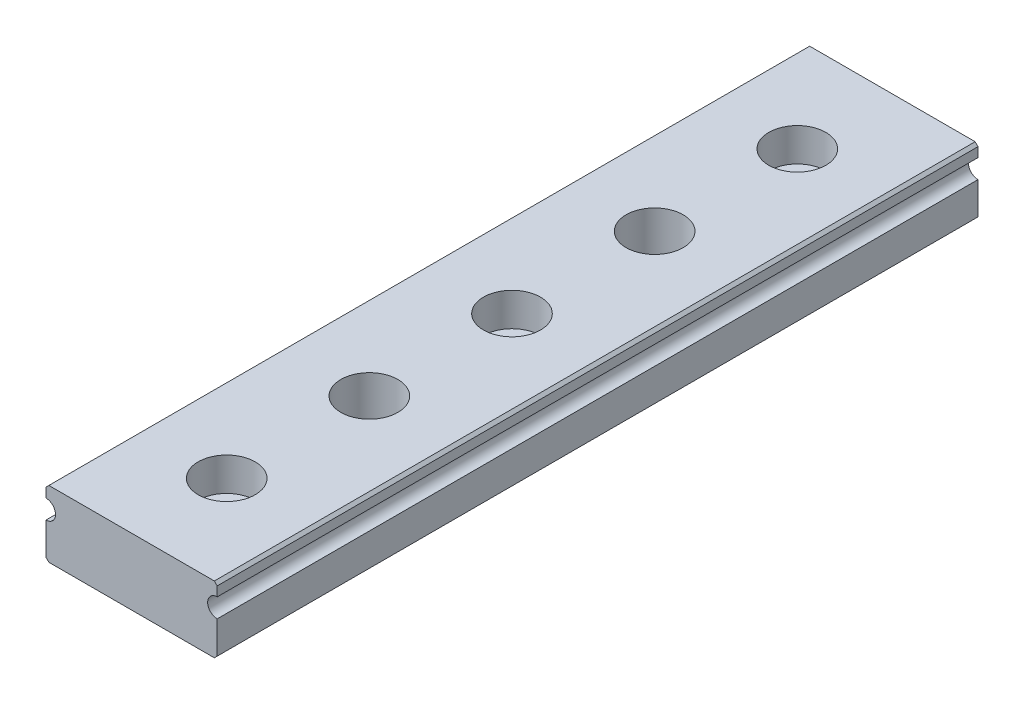
ISO-10303-21;
HEADER;
FILE_DESCRIPTION(('STEP AP214'),'2;1');
FILE_NAME('part.step','',(''),(''),'','','');
FILE_SCHEMA(('AUTOMOTIVE_DESIGN { 1 0 10303 214 1 1 1 1 }'));
ENDSEC;
DATA;
#1=APPLICATION_CONTEXT('core data for automotive mechanical design processes');
#2=APPLICATION_PROTOCOL_DEFINITION('international standard','automotive_design',2000,#1);
#3=PRODUCT_CONTEXT('',#1,'mechanical');
#4=PRODUCT('Part','Part','',(#3));
#5=PRODUCT_RELATED_PRODUCT_CATEGORY('part','',(#4));
#6=PRODUCT_DEFINITION_FORMATION('','',#4);
#7=PRODUCT_DEFINITION_CONTEXT('part definition',#1,'design');
#8=PRODUCT_DEFINITION('design','',#6,#7);
#9=PRODUCT_DEFINITION_SHAPE('','',#8);
#10=(LENGTH_UNIT() NAMED_UNIT(*) SI_UNIT(.MILLI.,.METRE.));
#11=(NAMED_UNIT(*) PLANE_ANGLE_UNIT() SI_UNIT($,.RADIAN.));
#12=(NAMED_UNIT(*) SI_UNIT($,.STERADIAN.) SOLID_ANGLE_UNIT());
#13=UNCERTAINTY_MEASURE_WITH_UNIT(LENGTH_MEASURE(1.E-05),#10,'distance_accuracy_value','');
#14=(GEOMETRIC_REPRESENTATION_CONTEXT(3) GLOBAL_UNCERTAINTY_ASSIGNED_CONTEXT((#13)) GLOBAL_UNIT_ASSIGNED_CONTEXT((#10,
#11,#12)) REPRESENTATION_CONTEXT('',''));
#15=CARTESIAN_POINT('',(0.,0.,0.));
#16=DIRECTION('',(0.,0.,1.));
#17=DIRECTION('',(1.,0.,0.));
#18=AXIS2_PLACEMENT_3D('',#15,#16,#17);
#19=CARTESIAN_POINT('',(0.,7.,0.));
#20=DIRECTION('',(0.,-1.,0.));
#21=DIRECTION('',(1.,0.,0.));
#22=AXIS2_PLACEMENT_3D('',#19,#20,#21);
#23=PLANE('',#22);
#24=CARTESIAN_POINT('',(-9.,7.,-70.));
#25=DIRECTION('',(0.,1.,0.));
#26=DIRECTION('',(0.,0.,1.));
#27=AXIS2_PLACEMENT_3D('',#24,#25,#26);
#28=CIRCLE('',#27,3.00000000000015);
#29=CARTESIAN_POINT('',(-9.,7.,-66.9999999999998));
#30=VERTEX_POINT('',#29);
#31=EDGE_CURVE('E311',#30,#30,#28,.T.);
#32=ORIENTED_EDGE('',*,*,#31,.F.);
#33=EDGE_LOOP('',(#32));
#34=FACE_BOUND('',#33,.T.);
#35=CARTESIAN_POINT('',(-9.,7.00000000000011,-55.));
#36=DIRECTION('',(0.,1.,0.));
#37=DIRECTION('',(0.,0.,1.));
#38=AXIS2_PLACEMENT_3D('',#35,#36,#37);
#39=CIRCLE('',#38,3.0000000000001);
#40=CARTESIAN_POINT('',(-9.,7.00000000000011,-51.9999999999999));
#41=VERTEX_POINT('',#40);
#42=EDGE_CURVE('E290',#41,#41,#39,.T.);
#43=ORIENTED_EDGE('',*,*,#42,.F.);
#44=EDGE_LOOP('',(#43));
#45=FACE_BOUND('',#44,.T.);
#46=CARTESIAN_POINT('',(-9.,7.,-10.));
#47=DIRECTION('',(0.,1.,0.));
#48=DIRECTION('',(0.,0.,1.));
#49=AXIS2_PLACEMENT_3D('',#46,#47,#48);
#50=CIRCLE('',#49,3.00000000000015);
#51=CARTESIAN_POINT('',(-9.,7.,-6.99999999999985));
#52=VERTEX_POINT('',#51);
#53=EDGE_CURVE('E287',#52,#52,#50,.T.);
#54=ORIENTED_EDGE('',*,*,#53,.F.);
#55=EDGE_LOOP('',(#54));
#56=FACE_BOUND('',#55,.T.);
#57=CARTESIAN_POINT('',(-9.,7.00000000000011,-25.));
#58=DIRECTION('',(0.,1.,0.));
#59=DIRECTION('',(0.,0.,1.));
#60=AXIS2_PLACEMENT_3D('',#57,#58,#59);
#61=CIRCLE('',#60,3.0000000000001);
#62=CARTESIAN_POINT('',(-9.,7.00000000000011,-21.9999999999999));
#63=VERTEX_POINT('',#62);
#64=EDGE_CURVE('E275',#63,#63,#61,.T.);
#65=ORIENTED_EDGE('',*,*,#64,.F.);
#66=EDGE_LOOP('',(#65));
#67=FACE_BOUND('',#66,.T.);
#68=DIRECTION('',(1.,0.,0.));
#69=VECTOR('',#68,1.);
#70=CARTESIAN_POINT('',(-18.0000000000009,7.,-80.));
#71=LINE('',#70,#69);
#72=CARTESIAN_POINT('',(-17.7000000000009,7.,-80.));
#73=VERTEX_POINT('',#72);
#74=CARTESIAN_POINT('',(-0.300000000000057,7.,-80.));
#75=VERTEX_POINT('',#74);
#76=EDGE_CURVE('E166',#73,#75,#71,.T.);
#77=ORIENTED_EDGE('',*,*,#76,.F.);
#78=DIRECTION('',(0.,0.,1.));
#79=VECTOR('',#78,1.);
#80=CARTESIAN_POINT('',(-17.7000000000009,7.,0.));
#81=LINE('',#80,#79);
#82=CARTESIAN_POINT('',(-17.7000000000009,7.,0.));
#83=VERTEX_POINT('',#82);
#84=EDGE_CURVE('E197',#73,#83,#81,.T.);
#85=ORIENTED_EDGE('',*,*,#84,.T.);
#86=DIRECTION('',(-1.,0.,0.));
#87=VECTOR('',#86,1.);
#88=CARTESIAN_POINT('',(0.,7.,0.));
#89=LINE('',#88,#87);
#90=CARTESIAN_POINT('',(-0.300000000000051,7.,0.));
#91=VERTEX_POINT('',#90);
#92=EDGE_CURVE('E168',#91,#83,#89,.T.);
#93=ORIENTED_EDGE('',*,*,#92,.F.);
#94=DIRECTION('',(0.,0.,-1.));
#95=VECTOR('',#94,1.);
#96=CARTESIAN_POINT('',(-0.300000000000051,7.,-80.));
#97=LINE('',#96,#95);
#98=EDGE_CURVE('E195',#91,#75,#97,.T.);
#99=ORIENTED_EDGE('',*,*,#98,.T.);
#100=EDGE_LOOP('',(#77,#85,#93,#99));
#101=FACE_BOUND('',#100,.T.);
#102=CARTESIAN_POINT('',(-9.,7.,-40.));
#103=DIRECTION('',(0.,1.,0.));
#104=DIRECTION('',(0.,0.,1.));
#105=AXIS2_PLACEMENT_3D('',#102,#103,#104);
#106=CIRCLE('',#105,3.00000000000015);
#107=CARTESIAN_POINT('',(-9.,7.,-36.9999999999999));
#108=VERTEX_POINT('',#107);
#109=EDGE_CURVE('E301',#108,#108,#106,.T.);
#110=ORIENTED_EDGE('',*,*,#109,.F.);
#111=EDGE_LOOP('',(#110));
#112=FACE_BOUND('',#111,.T.);
#113=ADVANCED_FACE('F35',(#34,#45,#56,#67,#101,#112),#23,.F.);
#114=CARTESIAN_POINT('',(0.,7.,-80.));
#115=DIRECTION('',(1.,0.,0.));
#116=DIRECTION('',(0.,1.,0.));
#117=AXIS2_PLACEMENT_3D('',#114,#115,#116);
#118=PLANE('',#117);
#119=DIRECTION('',(0.,-1.,0.));
#120=VECTOR('',#119,1.);
#121=CARTESIAN_POINT('',(0.,7.,0.));
#122=LINE('',#121,#120);
#123=CARTESIAN_POINT('',(0.,3.70000000000002,0.));
#124=VERTEX_POINT('',#123);
#125=CARTESIAN_POINT('',(0.,0.300000000000043,0.));
#126=VERTEX_POINT('',#125);
#127=EDGE_CURVE('E138',#124,#126,#122,.T.);
#128=ORIENTED_EDGE('',*,*,#127,.T.);
#129=DIRECTION('',(0.,0.,-1.));
#130=VECTOR('',#129,1.);
#131=CARTESIAN_POINT('',(0.,0.300000000000042,-80.));
#132=LINE('',#131,#130);
#133=CARTESIAN_POINT('',(0.,0.300000000000042,-80.));
#134=VERTEX_POINT('',#133);
#135=EDGE_CURVE('E43',#126,#134,#132,.T.);
#136=ORIENTED_EDGE('',*,*,#135,.T.);
#137=DIRECTION('',(0.,-1.,0.));
#138=VECTOR('',#137,1.);
#139=CARTESIAN_POINT('',(0.,7.,-80.));
#140=LINE('',#139,#138);
#141=CARTESIAN_POINT('',(0.,3.70000000000002,-80.));
#142=VERTEX_POINT('',#141);
#143=EDGE_CURVE('E139',#142,#134,#140,.T.);
#144=ORIENTED_EDGE('',*,*,#143,.F.);
#145=DIRECTION('',(0.,0.,-1.));
#146=VECTOR('',#145,1.);
#147=CARTESIAN_POINT('',(0.,3.70000000000002,-80.));
#148=LINE('',#147,#146);
#149=EDGE_CURVE('E147',#124,#142,#148,.T.);
#150=ORIENTED_EDGE('',*,*,#149,.F.);
#151=EDGE_LOOP('',(#128,#136,#144,#150));
#152=FACE_BOUND('',#151,.T.);
#153=ADVANCED_FACE('F214',(#152),#118,.T.);
#154=CARTESIAN_POINT('',(0.,7.,0.));
#155=DIRECTION('',(0.,0.,1.));
#156=DIRECTION('',(0.,-1.,0.));
#157=AXIS2_PLACEMENT_3D('',#154,#155,#156);
#158=PLANE('',#157);
#159=ORIENTED_EDGE('',*,*,#92,.T.);
#160=DIRECTION('',(-0.707106781186564,-0.707106781186531,0.));
#161=VECTOR('',#160,1.);
#162=CARTESIAN_POINT('',(-8.85000000000004,15.8500000000004,0.));
#163=LINE('',#162,#161);
#164=CARTESIAN_POINT('',(-18.0000000000009,6.69999999999998,0.));
#165=VERTEX_POINT('',#164);
#166=EDGE_CURVE('E203',#83,#165,#163,.T.);
#167=ORIENTED_EDGE('',*,*,#166,.T.);
#168=DIRECTION('',(0.,-1.,0.));
#169=VECTOR('',#168,1.);
#170=CARTESIAN_POINT('',(-18.0000000000009,7.,0.));
#171=LINE('',#170,#169);
#172=CARTESIAN_POINT('',(-18.0000000000009,5.69999999999998,1.11010799245048E-13));
#173=VERTEX_POINT('',#172);
#174=EDGE_CURVE('E176',#165,#173,#171,.T.);
#175=ORIENTED_EDGE('',*,*,#174,.T.);
#176=CARTESIAN_POINT('',(-18.0000000000014,4.7,1.11022302462516E-13));
#177=DIRECTION('',(0.,0.,-1.));
#178=DIRECTION('',(0.,1.,0.));
#179=AXIS2_PLACEMENT_3D('',#176,#177,#178);
#180=CIRCLE('',#179,0.99999999999998);
#181=CARTESIAN_POINT('',(-18.0000000000009,3.70000000000002,1.11033805679984E-13));
#182=VERTEX_POINT('',#181);
#183=EDGE_CURVE('E162',#173,#182,#180,.T.);
#184=ORIENTED_EDGE('',*,*,#183,.T.);
#185=CARTESIAN_POINT('',(-18.0000000000009,0.300000000000026,0.));
#186=VERTEX_POINT('',#185);
#187=EDGE_CURVE('E179',#182,#186,#171,.T.);
#188=ORIENTED_EDGE('',*,*,#187,.T.);
#189=DIRECTION('',(-0.707106781186531,0.707106781186564,0.));
#190=VECTOR('',#189,1.);
#191=CARTESIAN_POINT('',(-12.3500000000009,-5.3500000000003,0.));
#192=LINE('',#191,#190);
#193=CARTESIAN_POINT('',(-17.7000000000009,0.,0.));
#194=VERTEX_POINT('',#193);
#195=EDGE_CURVE('E56',#186,#194,#192,.F.);
#196=ORIENTED_EDGE('',*,*,#195,.T.);
#197=DIRECTION('',(-1.,0.,0.));
#198=VECTOR('',#197,1.);
#199=CARTESIAN_POINT('',(0.,0.,0.));
#200=LINE('',#199,#198);
#201=CARTESIAN_POINT('',(-0.300000000000023,0.,0.));
#202=VERTEX_POINT('',#201);
#203=EDGE_CURVE('E169',#202,#194,#200,.T.);
#204=ORIENTED_EDGE('',*,*,#203,.F.);
#205=DIRECTION('',(-0.707106781186523,-0.707106781186572,0.));
#206=VECTOR('',#205,1.);
#207=CARTESIAN_POINT('',(3.34999999999998,3.65000000000025,0.));
#208=LINE('',#207,#206);
#209=EDGE_CURVE('E50',#202,#126,#208,.F.);
#210=ORIENTED_EDGE('',*,*,#209,.T.);
#211=ORIENTED_EDGE('',*,*,#127,.F.);
#212=CARTESIAN_POINT('',(-4.66640615037761E-13,4.7,0.));
#213=DIRECTION('',(0.,0.,-1.));
#214=DIRECTION('',(0.,1.,0.));
#215=AXIS2_PLACEMENT_3D('',#212,#213,#214);
#216=CIRCLE('',#215,0.999999999999979);
#217=CARTESIAN_POINT('',(0.,5.69999999999998,0.));
#218=VERTEX_POINT('',#217);
#219=EDGE_CURVE('E154',#124,#218,#216,.T.);
#220=ORIENTED_EDGE('',*,*,#219,.T.);
#221=CARTESIAN_POINT('',(0.,6.69999999999997,0.));
#222=VERTEX_POINT('',#221);
#223=EDGE_CURVE('E153',#222,#218,#122,.T.);
#224=ORIENTED_EDGE('',*,*,#223,.F.);
#225=DIRECTION('',(-0.707106781186571,0.707106781186524,0.));
#226=VECTOR('',#225,1.);
#227=CARTESIAN_POINT('',(-0.150000000000016,6.84999999999997,0.));
#228=LINE('',#227,#226);
#229=EDGE_CURVE('E201',#222,#91,#228,.T.);
#230=ORIENTED_EDGE('',*,*,#229,.T.);
#231=EDGE_LOOP('',(#159,#167,#175,#184,#188,#196,#204,#210,#211,#220,#224,#230));
#232=FACE_BOUND('',#231,.T.);
#233=ADVANCED_FACE('F223',(#232),#158,.T.);
#234=CARTESIAN_POINT('',(-18.0000000000009,7.,0.));
#235=DIRECTION('',(-1.,0.,0.));
#236=DIRECTION('',(0.,-1.,0.));
#237=AXIS2_PLACEMENT_3D('',#234,#235,#236);
#238=PLANE('',#237);
#239=ORIENTED_EDGE('',*,*,#174,.F.);
#240=DIRECTION('',(0.,0.,-1.));
#241=VECTOR('',#240,1.);
#242=CARTESIAN_POINT('',(-18.0000000000009,6.69999999999997,-80.));
#243=LINE('',#242,#241);
#244=CARTESIAN_POINT('',(-18.0000000000009,6.69999999999997,-80.));
#245=VERTEX_POINT('',#244);
#246=EDGE_CURVE('E148',#165,#245,#243,.T.);
#247=ORIENTED_EDGE('',*,*,#246,.T.);
#248=DIRECTION('',(0.,-1.,0.));
#249=VECTOR('',#248,1.);
#250=CARTESIAN_POINT('',(-18.0000000000009,7.,-80.));
#251=LINE('',#250,#249);
#252=CARTESIAN_POINT('',(-18.0000000000009,5.69999999999999,-80.));
#253=VERTEX_POINT('',#252);
#254=EDGE_CURVE('E181',#245,#253,#251,.T.);
#255=ORIENTED_EDGE('',*,*,#254,.T.);
#256=DIRECTION('',(0.,0.,-1.));
#257=VECTOR('',#256,1.);
#258=CARTESIAN_POINT('',(-18.0000000000009,5.69999999999999,-79.9999999999999));
#259=LINE('',#258,#257);
#260=EDGE_CURVE('E149',#173,#253,#259,.T.);
#261=ORIENTED_EDGE('',*,*,#260,.F.);
#262=EDGE_LOOP('',(#239,#247,#255,#261));
#263=FACE_BOUND('',#262,.T.);
#264=ADVANCED_FACE('F227',(#263),#238,.T.);
#265=CARTESIAN_POINT('',(-18.0000000000009,3.70000000000002,-79.9999999999999));
#266=VERTEX_POINT('',#265);
#267=CARTESIAN_POINT('',(-18.0000000000009,0.300000000000025,-80.));
#268=VERTEX_POINT('',#267);
#269=EDGE_CURVE('E172',#266,#268,#251,.T.);
#270=ORIENTED_EDGE('',*,*,#269,.T.);
#271=DIRECTION('',(0.,0.,1.));
#272=VECTOR('',#271,1.);
#273=CARTESIAN_POINT('',(-18.0000000000009,0.300000000000026,0.));
#274=LINE('',#273,#272);
#275=EDGE_CURVE('E11',#268,#186,#274,.T.);
#276=ORIENTED_EDGE('',*,*,#275,.T.);
#277=ORIENTED_EDGE('',*,*,#187,.F.);
#278=DIRECTION('',(0.,0.,-1.));
#279=VECTOR('',#278,1.);
#280=CARTESIAN_POINT('',(-18.0000000000009,3.70000000000002,-79.9999999999999));
#281=LINE('',#280,#279);
#282=EDGE_CURVE('E178',#266,#182,#281,.F.);
#283=ORIENTED_EDGE('',*,*,#282,.F.);
#284=EDGE_LOOP('',(#270,#276,#277,#283));
#285=FACE_BOUND('',#284,.T.);
#286=ADVANCED_FACE('F233',(#285),#238,.T.);
#287=CARTESIAN_POINT('',(0.,6.69999999999997,-80.));
#288=VERTEX_POINT('',#287);
#289=CARTESIAN_POINT('',(0.,5.69999999999999,-80.));
#290=VERTEX_POINT('',#289);
#291=EDGE_CURVE('E124',#288,#290,#140,.T.);
#292=ORIENTED_EDGE('',*,*,#291,.F.);
#293=DIRECTION('',(0.,0.,1.));
#294=VECTOR('',#293,1.);
#295=CARTESIAN_POINT('',(0.,6.69999999999997,0.));
#296=LINE('',#295,#294);
#297=EDGE_CURVE('E205',#288,#222,#296,.T.);
#298=ORIENTED_EDGE('',*,*,#297,.T.);
#299=ORIENTED_EDGE('',*,*,#223,.T.);
#300=DIRECTION('',(0.,0.,-1.));
#301=VECTOR('',#300,1.);
#302=CARTESIAN_POINT('',(0.,5.69999999999999,-80.));
#303=LINE('',#302,#301);
#304=EDGE_CURVE('E144',#290,#218,#303,.F.);
#305=ORIENTED_EDGE('',*,*,#304,.F.);
#306=EDGE_LOOP('',(#292,#298,#299,#305));
#307=FACE_BOUND('',#306,.T.);
#308=ADVANCED_FACE('F151',(#307),#118,.T.);
#309=CARTESIAN_POINT('',(-18.0000000000009,7.,-80.));
#310=DIRECTION('',(0.,0.,-1.));
#311=DIRECTION('',(0.,1.,0.));
#312=AXIS2_PLACEMENT_3D('',#309,#310,#311);
#313=PLANE('',#312);
#314=ORIENTED_EDGE('',*,*,#254,.F.);
#315=DIRECTION('',(0.707106781186564,0.707106781186531,0.));
#316=VECTOR('',#315,1.);
#317=CARTESIAN_POINT('',(-17.8500000000009,6.84999999999998,-80.));
#318=LINE('',#317,#316);
#319=EDGE_CURVE('E193',#245,#73,#318,.T.);
#320=ORIENTED_EDGE('',*,*,#319,.T.);
#321=ORIENTED_EDGE('',*,*,#76,.T.);
#322=DIRECTION('',(0.707106781186571,-0.707106781186524,0.));
#323=VECTOR('',#322,1.);
#324=CARTESIAN_POINT('',(-9.15000000000107,15.8500000000004,-80.));
#325=LINE('',#324,#323);
#326=EDGE_CURVE('E133',#75,#288,#325,.T.);
#327=ORIENTED_EDGE('',*,*,#326,.T.);
#328=ORIENTED_EDGE('',*,*,#291,.T.);
#329=CARTESIAN_POINT('',(-4.66640615037761E-13,4.7,-80.));
#330=DIRECTION('',(0.,0.,-1.));
#331=DIRECTION('',(0.,1.,0.));
#332=AXIS2_PLACEMENT_3D('',#329,#330,#331);
#333=CIRCLE('',#332,0.999999999999987);
#334=EDGE_CURVE('E129',#142,#290,#333,.T.);
#335=ORIENTED_EDGE('',*,*,#334,.F.);
#336=ORIENTED_EDGE('',*,*,#143,.T.);
#337=DIRECTION('',(0.707106781186523,0.707106781186572,0.));
#338=VECTOR('',#337,1.);
#339=CARTESIAN_POINT('',(-5.64999999999986,-5.35000000000021,-80.));
#340=LINE('',#339,#338);
#341=CARTESIAN_POINT('',(-0.300000000000029,0.,-80.));
#342=VERTEX_POINT('',#341);
#343=EDGE_CURVE('E190',#134,#342,#340,.F.);
#344=ORIENTED_EDGE('',*,*,#343,.T.);
#345=DIRECTION('',(1.,0.,0.));
#346=VECTOR('',#345,1.);
#347=CARTESIAN_POINT('',(-18.0000000000009,0.,-80.));
#348=LINE('',#347,#346);
#349=CARTESIAN_POINT('',(-17.7000000000009,0.,-80.));
#350=VERTEX_POINT('',#349);
#351=EDGE_CURVE('E165',#350,#342,#348,.T.);
#352=ORIENTED_EDGE('',*,*,#351,.F.);
#353=DIRECTION('',(0.707106781186531,-0.707106781186564,0.));
#354=VECTOR('',#353,1.);
#355=CARTESIAN_POINT('',(-21.3500000000009,3.65000000000016,-80.));
#356=LINE('',#355,#354);
#357=EDGE_CURVE('E188',#350,#268,#356,.F.);
#358=ORIENTED_EDGE('',*,*,#357,.T.);
#359=ORIENTED_EDGE('',*,*,#269,.F.);
#360=CARTESIAN_POINT('',(-18.0000000000014,4.7,-79.9999999999999));
#361=DIRECTION('',(0.,0.,-1.));
#362=DIRECTION('',(0.,1.,0.));
#363=AXIS2_PLACEMENT_3D('',#360,#361,#362);
#364=CIRCLE('',#363,0.999999999999987);
#365=EDGE_CURVE('E156',#253,#266,#364,.T.);
#366=ORIENTED_EDGE('',*,*,#365,.F.);
#367=EDGE_LOOP('',(#314,#320,#321,#327,#328,#335,#336,#344,#352,#358,#359,#366));
#368=FACE_BOUND('',#367,.T.);
#369=ADVANCED_FACE('F127',(#368),#313,.T.);
#370=CARTESIAN_POINT('',(0.,0.,0.));
#371=DIRECTION('',(0.,-1.,0.));
#372=DIRECTION('',(1.,0.,0.));
#373=AXIS2_PLACEMENT_3D('',#370,#371,#372);
#374=PLANE('',#373);
#375=CARTESIAN_POINT('',(-9.,0.,-70.));
#376=DIRECTION('',(0.,1.,0.));
#377=DIRECTION('',(0.,0.,1.));
#378=AXIS2_PLACEMENT_3D('',#375,#376,#377);
#379=CIRCLE('',#378,1.75000000000015);
#380=CARTESIAN_POINT('',(-9.,0.,-68.2499999999998));
#381=VERTEX_POINT('',#380);
#382=EDGE_CURVE('E259',#381,#381,#379,.T.);
#383=ORIENTED_EDGE('',*,*,#382,.T.);
#384=EDGE_LOOP('',(#383));
#385=FACE_BOUND('',#384,.T.);
#386=CARTESIAN_POINT('',(-9.,0.,-40.));
#387=DIRECTION('',(0.,1.,0.));
#388=DIRECTION('',(0.,0.,1.));
#389=AXIS2_PLACEMENT_3D('',#386,#387,#388);
#390=CIRCLE('',#389,1.75000000000015);
#391=CARTESIAN_POINT('',(-9.,0.,-38.2499999999998));
#392=VERTEX_POINT('',#391);
#393=EDGE_CURVE('E263',#392,#392,#390,.T.);
#394=ORIENTED_EDGE('',*,*,#393,.T.);
#395=EDGE_LOOP('',(#394));
#396=FACE_BOUND('',#395,.T.);
#397=CARTESIAN_POINT('',(-9.,0.,-55.));
#398=DIRECTION('',(0.,1.,0.));
#399=DIRECTION('',(0.,0.,1.));
#400=AXIS2_PLACEMENT_3D('',#397,#398,#399);
#401=CIRCLE('',#400,3.0000000000001);
#402=CARTESIAN_POINT('',(-9.,0.,-51.9999999999999));
#403=VERTEX_POINT('',#402);
#404=EDGE_CURVE('E267',#403,#403,#401,.T.);
#405=ORIENTED_EDGE('',*,*,#404,.T.);
#406=EDGE_LOOP('',(#405));
#407=FACE_BOUND('',#406,.T.);
#408=CARTESIAN_POINT('',(-9.,0.,-10.));
#409=DIRECTION('',(0.,1.,0.));
#410=DIRECTION('',(0.,0.,1.));
#411=AXIS2_PLACEMENT_3D('',#408,#409,#410);
#412=CIRCLE('',#411,1.75000000000015);
#413=CARTESIAN_POINT('',(-9.,0.,-8.24999999999985));
#414=VERTEX_POINT('',#413);
#415=EDGE_CURVE('E271',#414,#414,#412,.T.);
#416=ORIENTED_EDGE('',*,*,#415,.T.);
#417=EDGE_LOOP('',(#416));
#418=FACE_BOUND('',#417,.T.);
#419=CARTESIAN_POINT('',(-9.,0.,-25.));
#420=DIRECTION('',(0.,1.,0.));
#421=DIRECTION('',(0.,0.,1.));
#422=AXIS2_PLACEMENT_3D('',#419,#420,#421);
#423=CIRCLE('',#422,3.0000000000001);
#424=CARTESIAN_POINT('',(-9.,0.,-21.9999999999999));
#425=VERTEX_POINT('',#424);
#426=EDGE_CURVE('E158',#425,#425,#423,.T.);
#427=ORIENTED_EDGE('',*,*,#426,.T.);
#428=EDGE_LOOP('',(#427));
#429=FACE_BOUND('',#428,.T.);
#430=ORIENTED_EDGE('',*,*,#351,.T.);
#431=DIRECTION('',(0.,0.,1.));
#432=VECTOR('',#431,1.);
#433=CARTESIAN_POINT('',(-0.300000000000023,0.,0.));
#434=LINE('',#433,#432);
#435=EDGE_CURVE('E210',#342,#202,#434,.T.);
#436=ORIENTED_EDGE('',*,*,#435,.T.);
#437=ORIENTED_EDGE('',*,*,#203,.T.);
#438=DIRECTION('',(0.,0.,-1.));
#439=VECTOR('',#438,1.);
#440=CARTESIAN_POINT('',(-17.7000000000009,0.,0.));
#441=LINE('',#440,#439);
#442=EDGE_CURVE('E207',#194,#350,#441,.T.);
#443=ORIENTED_EDGE('',*,*,#442,.T.);
#444=EDGE_LOOP('',(#430,#436,#437,#443));
#445=FACE_BOUND('',#444,.T.);
#446=ADVANCED_FACE('F221',(#385,#396,#407,#418,#429,#445),#374,.T.);
#447=CARTESIAN_POINT('',(-18.0000000000014,4.7,-79.9999999999999));
#448=DIRECTION('',(0.,0.,-1.));
#449=DIRECTION('',(0.,1.,0.));
#450=AXIS2_PLACEMENT_3D('',#447,#448,#449);
#451=CYLINDRICAL_SURFACE('',#450,0.999999999999984);
#452=ORIENTED_EDGE('',*,*,#260,.T.);
#453=ORIENTED_EDGE('',*,*,#365,.T.);
#454=ORIENTED_EDGE('',*,*,#282,.T.);
#455=ORIENTED_EDGE('',*,*,#183,.F.);
#456=EDGE_LOOP('',(#452,#453,#454,#455));
#457=FACE_BOUND('',#456,.T.);
#458=ADVANCED_FACE('F246',(#457),#451,.F.);
#459=CARTESIAN_POINT('',(-4.66640615037761E-13,4.7,-80.));
#460=DIRECTION('',(0.,0.,-1.));
#461=DIRECTION('',(0.,1.,0.));
#462=AXIS2_PLACEMENT_3D('',#459,#460,#461);
#463=CYLINDRICAL_SURFACE('',#462,0.999999999999983);
#464=ORIENTED_EDGE('',*,*,#149,.T.);
#465=ORIENTED_EDGE('',*,*,#334,.T.);
#466=ORIENTED_EDGE('',*,*,#304,.T.);
#467=ORIENTED_EDGE('',*,*,#219,.F.);
#468=EDGE_LOOP('',(#464,#465,#466,#467));
#469=FACE_BOUND('',#468,.T.);
#470=ADVANCED_FACE('F143',(#469),#463,.F.);
#471=CARTESIAN_POINT('',(-9.,7.00000000000011,-25.));
#472=DIRECTION('',(0.,1.,0.));
#473=DIRECTION('',(0.,0.,1.));
#474=AXIS2_PLACEMENT_3D('',#471,#472,#473);
#475=CYLINDRICAL_SURFACE('',#474,3.0000000000001);
#476=ORIENTED_EDGE('',*,*,#426,.F.);
#477=EDGE_LOOP('',(#476));
#478=FACE_BOUND('',#477,.T.);
#479=ORIENTED_EDGE('',*,*,#64,.T.);
#480=EDGE_LOOP('',(#479));
#481=FACE_BOUND('',#480,.T.);
#482=ADVANCED_FACE('F362',(#478,#481),#475,.F.);
#483=CARTESIAN_POINT('',(-9.,7.,-10.));
#484=DIRECTION('',(0.,1.,0.));
#485=DIRECTION('',(0.,0.,1.));
#486=AXIS2_PLACEMENT_3D('',#483,#484,#485);
#487=CYLINDRICAL_SURFACE('',#486,1.75000000000015);
#488=ORIENTED_EDGE('',*,*,#415,.F.);
#489=EDGE_LOOP('',(#488));
#490=FACE_BOUND('',#489,.T.);
#491=CARTESIAN_POINT('',(-9.,3.5,-10.));
#492=DIRECTION('',(0.,1.,0.));
#493=DIRECTION('',(0.,0.,1.));
#494=AXIS2_PLACEMENT_3D('',#491,#492,#493);
#495=CIRCLE('',#494,1.75000000000016);
#496=CARTESIAN_POINT('',(-9.,3.5,-8.24999999999984));
#497=VERTEX_POINT('',#496);
#498=EDGE_CURVE('E281',#497,#497,#495,.T.);
#499=ORIENTED_EDGE('',*,*,#498,.T.);
#500=EDGE_LOOP('',(#499));
#501=FACE_BOUND('',#500,.T.);
#502=ADVANCED_FACE('F358',(#490,#501),#487,.F.);
#503=CARTESIAN_POINT('',(-7.24999999999985,3.5,-10.));
#504=DIRECTION('',(0.,-1.,0.));
#505=DIRECTION('',(0.,0.,-1.));
#506=AXIS2_PLACEMENT_3D('',#503,#504,#505);
#507=PLANE('',#506);
#508=ORIENTED_EDGE('',*,*,#498,.F.);
#509=EDGE_LOOP('',(#508));
#510=FACE_BOUND('',#509,.T.);
#511=CARTESIAN_POINT('',(-9.,3.5,-10.));
#512=DIRECTION('',(0.,1.,0.));
#513=DIRECTION('',(0.,0.,1.));
#514=AXIS2_PLACEMENT_3D('',#511,#512,#513);
#515=CIRCLE('',#514,3.00000000000015);
#516=CARTESIAN_POINT('',(-9.,3.5,-6.99999999999985));
#517=VERTEX_POINT('',#516);
#518=EDGE_CURVE('E284',#517,#517,#515,.T.);
#519=ORIENTED_EDGE('',*,*,#518,.T.);
#520=EDGE_LOOP('',(#519));
#521=FACE_BOUND('',#520,.T.);
#522=ADVANCED_FACE('F354',(#510,#521),#507,.F.);
#523=CARTESIAN_POINT('',(-9.,7.,-10.));
#524=DIRECTION('',(0.,1.,0.));
#525=DIRECTION('',(0.,0.,1.));
#526=AXIS2_PLACEMENT_3D('',#523,#524,#525);
#527=CYLINDRICAL_SURFACE('',#526,3.00000000000015);
#528=ORIENTED_EDGE('',*,*,#518,.F.);
#529=EDGE_LOOP('',(#528));
#530=FACE_BOUND('',#529,.T.);
#531=ORIENTED_EDGE('',*,*,#53,.T.);
#532=EDGE_LOOP('',(#531));
#533=FACE_BOUND('',#532,.T.);
#534=ADVANCED_FACE('F350',(#530,#533),#527,.F.);
#535=CARTESIAN_POINT('',(-9.,7.00000000000011,-55.));
#536=DIRECTION('',(0.,1.,0.));
#537=DIRECTION('',(0.,0.,1.));
#538=AXIS2_PLACEMENT_3D('',#535,#536,#537);
#539=CYLINDRICAL_SURFACE('',#538,3.0000000000001);
#540=ORIENTED_EDGE('',*,*,#404,.F.);
#541=EDGE_LOOP('',(#540));
#542=FACE_BOUND('',#541,.T.);
#543=ORIENTED_EDGE('',*,*,#42,.T.);
#544=EDGE_LOOP('',(#543));
#545=FACE_BOUND('',#544,.T.);
#546=ADVANCED_FACE('F346',(#542,#545),#539,.F.);
#547=CARTESIAN_POINT('',(-9.,7.,-40.));
#548=DIRECTION('',(0.,1.,0.));
#549=DIRECTION('',(0.,0.,1.));
#550=AXIS2_PLACEMENT_3D('',#547,#548,#549);
#551=CYLINDRICAL_SURFACE('',#550,1.75000000000015);
#552=ORIENTED_EDGE('',*,*,#393,.F.);
#553=EDGE_LOOP('',(#552));
#554=FACE_BOUND('',#553,.T.);
#555=CARTESIAN_POINT('',(-9.,3.5,-40.));
#556=DIRECTION('',(0.,1.,0.));
#557=DIRECTION('',(0.,0.,1.));
#558=AXIS2_PLACEMENT_3D('',#555,#556,#557);
#559=CIRCLE('',#558,1.75000000000016);
#560=CARTESIAN_POINT('',(-9.,3.5,-38.2499999999998));
#561=VERTEX_POINT('',#560);
#562=EDGE_CURVE('E295',#561,#561,#559,.T.);
#563=ORIENTED_EDGE('',*,*,#562,.T.);
#564=EDGE_LOOP('',(#563));
#565=FACE_BOUND('',#564,.T.);
#566=ADVANCED_FACE('F342',(#554,#565),#551,.F.);
#567=CARTESIAN_POINT('',(-7.24999999999985,3.5,-40.));
#568=DIRECTION('',(0.,-1.,0.));
#569=DIRECTION('',(0.,0.,-1.));
#570=AXIS2_PLACEMENT_3D('',#567,#568,#569);
#571=PLANE('',#570);
#572=ORIENTED_EDGE('',*,*,#562,.F.);
#573=EDGE_LOOP('',(#572));
#574=FACE_BOUND('',#573,.T.);
#575=CARTESIAN_POINT('',(-9.,3.5,-40.));
#576=DIRECTION('',(0.,1.,0.));
#577=DIRECTION('',(0.,0.,1.));
#578=AXIS2_PLACEMENT_3D('',#575,#576,#577);
#579=CIRCLE('',#578,3.00000000000015);
#580=CARTESIAN_POINT('',(-9.,3.5,-36.9999999999999));
#581=VERTEX_POINT('',#580);
#582=EDGE_CURVE('E298',#581,#581,#579,.T.);
#583=ORIENTED_EDGE('',*,*,#582,.T.);
#584=EDGE_LOOP('',(#583));
#585=FACE_BOUND('',#584,.T.);
#586=ADVANCED_FACE('F338',(#574,#585),#571,.F.);
#587=CARTESIAN_POINT('',(-9.,7.,-40.));
#588=DIRECTION('',(0.,1.,0.));
#589=DIRECTION('',(0.,0.,1.));
#590=AXIS2_PLACEMENT_3D('',#587,#588,#589);
#591=CYLINDRICAL_SURFACE('',#590,3.00000000000015);
#592=ORIENTED_EDGE('',*,*,#582,.F.);
#593=EDGE_LOOP('',(#592));
#594=FACE_BOUND('',#593,.T.);
#595=ORIENTED_EDGE('',*,*,#109,.T.);
#596=EDGE_LOOP('',(#595));
#597=FACE_BOUND('',#596,.T.);
#598=ADVANCED_FACE('F334',(#594,#597),#591,.F.);
#599=CARTESIAN_POINT('',(-9.,7.,-70.));
#600=DIRECTION('',(0.,1.,0.));
#601=DIRECTION('',(0.,0.,1.));
#602=AXIS2_PLACEMENT_3D('',#599,#600,#601);
#603=CYLINDRICAL_SURFACE('',#602,1.75000000000015);
#604=ORIENTED_EDGE('',*,*,#382,.F.);
#605=EDGE_LOOP('',(#604));
#606=FACE_BOUND('',#605,.T.);
#607=CARTESIAN_POINT('',(-9.,3.49999999999999,-70.));
#608=DIRECTION('',(0.,1.,0.));
#609=DIRECTION('',(0.,0.,1.));
#610=AXIS2_PLACEMENT_3D('',#607,#608,#609);
#611=CIRCLE('',#610,1.75000000000016);
#612=CARTESIAN_POINT('',(-9.,3.49999999999999,-68.2499999999998));
#613=VERTEX_POINT('',#612);
#614=EDGE_CURVE('E305',#613,#613,#611,.T.);
#615=ORIENTED_EDGE('',*,*,#614,.T.);
#616=EDGE_LOOP('',(#615));
#617=FACE_BOUND('',#616,.T.);
#618=ADVANCED_FACE('F327',(#606,#617),#603,.F.);
#619=CARTESIAN_POINT('',(-7.24999999999985,3.49999999999999,-70.));
#620=DIRECTION('',(0.,-1.,0.));
#621=DIRECTION('',(0.,0.,-1.));
#622=AXIS2_PLACEMENT_3D('',#619,#620,#621);
#623=PLANE('',#622);
#624=ORIENTED_EDGE('',*,*,#614,.F.);
#625=EDGE_LOOP('',(#624));
#626=FACE_BOUND('',#625,.T.);
#627=CARTESIAN_POINT('',(-9.,3.49999999999999,-70.));
#628=DIRECTION('',(0.,1.,0.));
#629=DIRECTION('',(0.,0.,1.));
#630=AXIS2_PLACEMENT_3D('',#627,#628,#629);
#631=CIRCLE('',#630,3.00000000000015);
#632=CARTESIAN_POINT('',(-9.,3.49999999999999,-66.9999999999998));
#633=VERTEX_POINT('',#632);
#634=EDGE_CURVE('E308',#633,#633,#631,.T.);
#635=ORIENTED_EDGE('',*,*,#634,.T.);
#636=EDGE_LOOP('',(#635));
#637=FACE_BOUND('',#636,.T.);
#638=ADVANCED_FACE('F317',(#626,#637),#623,.F.);
#639=CARTESIAN_POINT('',(-9.,7.,-70.));
#640=DIRECTION('',(0.,1.,0.));
#641=DIRECTION('',(0.,0.,1.));
#642=AXIS2_PLACEMENT_3D('',#639,#640,#641);
#643=CYLINDRICAL_SURFACE('',#642,3.00000000000015);
#644=ORIENTED_EDGE('',*,*,#634,.F.);
#645=EDGE_LOOP('',(#644));
#646=FACE_BOUND('',#645,.T.);
#647=ORIENTED_EDGE('',*,*,#31,.T.);
#648=EDGE_LOOP('',(#647));
#649=FACE_BOUND('',#648,.T.);
#650=ADVANCED_FACE('F314',(#646,#649),#643,.F.);
#651=CARTESIAN_POINT('',(-18.0000000000009,6.69999999999998,0.));
#652=DIRECTION('',(-0.707106781186531,0.707106781186564,0.));
#653=DIRECTION('',(0.,0.,1.));
#654=AXIS2_PLACEMENT_3D('',#651,#652,#653);
#655=PLANE('',#654);
#656=ORIENTED_EDGE('',*,*,#166,.F.);
#657=ORIENTED_EDGE('',*,*,#84,.F.);
#658=ORIENTED_EDGE('',*,*,#319,.F.);
#659=ORIENTED_EDGE('',*,*,#246,.F.);
#660=EDGE_LOOP('',(#656,#657,#658,#659));
#661=FACE_BOUND('',#660,.T.);
#662=ADVANCED_FACE('F316',(#661),#655,.T.);
#663=CARTESIAN_POINT('',(0.,6.69999999999997,-80.));
#664=DIRECTION('',(0.707106781186524,0.707106781186571,0.));
#665=DIRECTION('',(0.,0.,-1.));
#666=AXIS2_PLACEMENT_3D('',#663,#664,#665);
#667=PLANE('',#666);
#668=ORIENTED_EDGE('',*,*,#326,.F.);
#669=ORIENTED_EDGE('',*,*,#98,.F.);
#670=ORIENTED_EDGE('',*,*,#229,.F.);
#671=ORIENTED_EDGE('',*,*,#297,.F.);
#672=EDGE_LOOP('',(#668,#669,#670,#671));
#673=FACE_BOUND('',#672,.T.);
#674=ADVANCED_FACE('F324',(#673),#667,.T.);
#675=CARTESIAN_POINT('',(-0.300000000000023,0.,0.));
#676=DIRECTION('',(-0.707106781186572,0.707106781186523,0.));
#677=DIRECTION('',(0.,0.,1.));
#678=AXIS2_PLACEMENT_3D('',#675,#676,#677);
#679=PLANE('',#678);
#680=ORIENTED_EDGE('',*,*,#343,.F.);
#681=ORIENTED_EDGE('',*,*,#135,.F.);
#682=ORIENTED_EDGE('',*,*,#209,.F.);
#683=ORIENTED_EDGE('',*,*,#435,.F.);
#684=EDGE_LOOP('',(#680,#681,#682,#683));
#685=FACE_BOUND('',#684,.T.);
#686=ADVANCED_FACE('F219',(#685),#679,.F.);
#687=CARTESIAN_POINT('',(-17.7000000000009,0.,0.));
#688=DIRECTION('',(0.707106781186564,0.707106781186531,0.));
#689=DIRECTION('',(0.,0.,-1.));
#690=AXIS2_PLACEMENT_3D('',#687,#688,#689);
#691=PLANE('',#690);
#692=ORIENTED_EDGE('',*,*,#195,.F.);
#693=ORIENTED_EDGE('',*,*,#275,.F.);
#694=ORIENTED_EDGE('',*,*,#357,.F.);
#695=ORIENTED_EDGE('',*,*,#442,.F.);
#696=EDGE_LOOP('',(#692,#693,#694,#695));
#697=FACE_BOUND('',#696,.T.);
#698=ADVANCED_FACE('F37',(#697),#691,.F.);
#699=CLOSED_SHELL('',(#113,#153,#233,#264,#286,#308,#369,#446,#458,#470,#482,#502,#522,#534,
#546,#566,#586,#598,#618,#638,#650,#662,#674,#686,#698));
#700=MANIFOLD_SOLID_BREP('B2',#699);
#701=ADVANCED_BREP_SHAPE_REPRESENTATION('',(#18,#700),#14);
#702=SHAPE_DEFINITION_REPRESENTATION(#9,#701);
ENDSEC;
END-ISO-10303-21;
